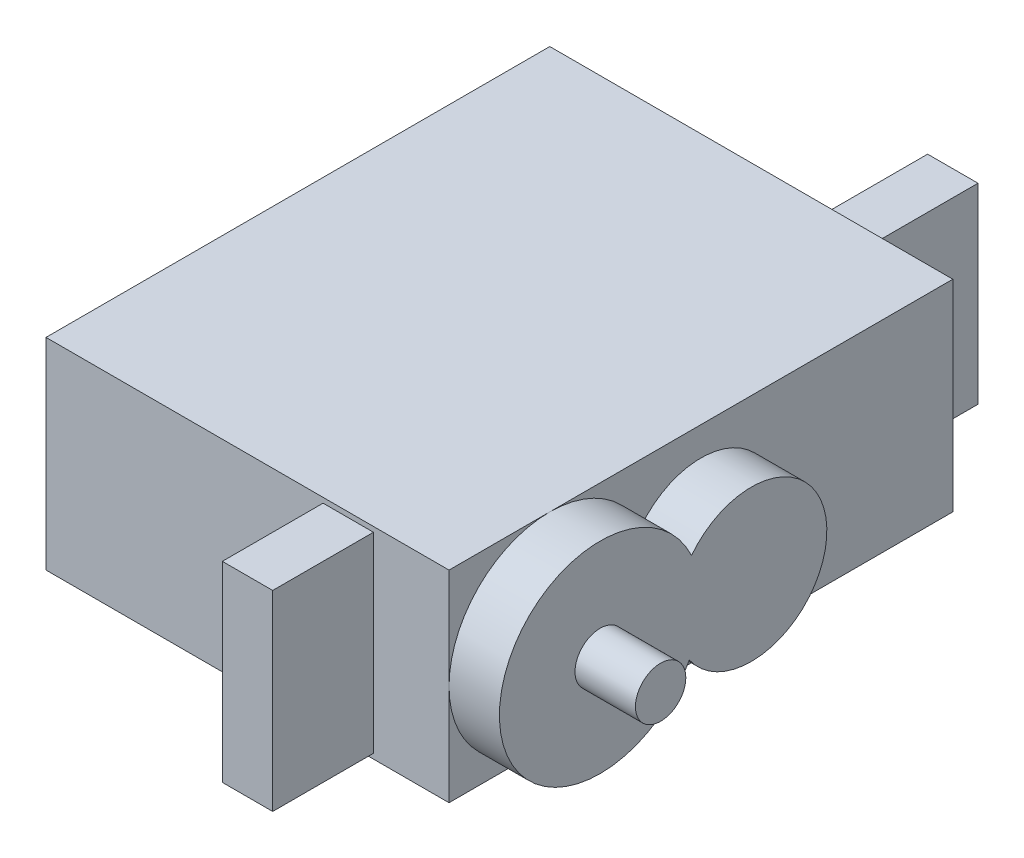
ISO-10303-21;
HEADER;
FILE_DESCRIPTION(('STEP AP214'),'2;1');
FILE_NAME('part.step','',(''),(''),'','','');
FILE_SCHEMA(('AUTOMOTIVE_DESIGN { 1 0 10303 214 1 1 1 1 }'));
ENDSEC;
DATA;
#1=APPLICATION_CONTEXT('core data for automotive mechanical design processes');
#2=APPLICATION_PROTOCOL_DEFINITION('international standard','automotive_design',2000,#1);
#3=PRODUCT_CONTEXT('',#1,'mechanical');
#4=PRODUCT('Part','Part','',(#3));
#5=PRODUCT_RELATED_PRODUCT_CATEGORY('part','',(#4));
#6=PRODUCT_DEFINITION_FORMATION('','',#4);
#7=PRODUCT_DEFINITION_CONTEXT('part definition',#1,'design');
#8=PRODUCT_DEFINITION('design','',#6,#7);
#9=PRODUCT_DEFINITION_SHAPE('','',#8);
#10=(LENGTH_UNIT() NAMED_UNIT(*) SI_UNIT(.MILLI.,.METRE.));
#11=(NAMED_UNIT(*) PLANE_ANGLE_UNIT() SI_UNIT($,.RADIAN.));
#12=(NAMED_UNIT(*) SI_UNIT($,.STERADIAN.) SOLID_ANGLE_UNIT());
#13=UNCERTAINTY_MEASURE_WITH_UNIT(LENGTH_MEASURE(1.E-05),#10,'distance_accuracy_value','');
#14=(GEOMETRIC_REPRESENTATION_CONTEXT(3) GLOBAL_UNCERTAINTY_ASSIGNED_CONTEXT((#13)) GLOBAL_UNIT_ASSIGNED_CONTEXT((#10,
#11,#12)) REPRESENTATION_CONTEXT('',''));
#15=CARTESIAN_POINT('',(0.,0.,0.));
#16=DIRECTION('',(0.,0.,1.));
#17=DIRECTION('',(1.,0.,0.));
#18=AXIS2_PLACEMENT_3D('',#15,#16,#17);
#19=CARTESIAN_POINT('',(10.,10.,12.5));
#20=DIRECTION('',(-1.,0.,0.));
#21=DIRECTION('',(0.,0.,1.));
#22=AXIS2_PLACEMENT_3D('',#19,#20,#21);
#23=PLANE('',#22);
#24=CARTESIAN_POINT('',(10.,4.81801900138163,0.));
#25=DIRECTION('',(1.,0.,0.));
#26=DIRECTION('',(0.,0.,-1.));
#27=AXIS2_PLACEMENT_3D('',#24,#25,#26);
#28=CIRCLE('',#27,3.75);
#29=CARTESIAN_POINT('',(10.,2.67182303274343,3.07511672367101));
#30=VERTEX_POINT('',#29);
#31=CARTESIAN_POINT('',(10.,7.11083159517213,2.96740802886218));
#32=VERTEX_POINT('',#31);
#33=EDGE_CURVE('E174',#30,#32,#28,.T.);
#34=ORIENTED_EDGE('',*,*,#33,.F.);
#35=CARTESIAN_POINT('',(10.,5.,7.5));
#36=DIRECTION('',(1.,0.,0.));
#37=DIRECTION('',(0.,0.,-1.));
#38=AXIS2_PLACEMENT_3D('',#35,#36,#37);
#39=CIRCLE('',#38,5.);
#40=CARTESIAN_POINT('',(10.,0.,7.5));
#41=VERTEX_POINT('',#40);
#42=EDGE_CURVE('E315',#41,#30,#39,.T.);
#43=ORIENTED_EDGE('',*,*,#42,.F.);
#44=DIRECTION('',(0.,0.,-1.));
#45=VECTOR('',#44,1.);
#46=CARTESIAN_POINT('',(10.,0.,12.5));
#47=LINE('',#46,#45);
#48=CARTESIAN_POINT('',(10.,0.,-12.5));
#49=VERTEX_POINT('',#48);
#50=EDGE_CURVE('E270',#41,#49,#47,.T.);
#51=ORIENTED_EDGE('',*,*,#50,.T.);
#52=DIRECTION('',(0.,-1.,0.));
#53=VECTOR('',#52,1.);
#54=CARTESIAN_POINT('',(10.,10.,-12.5));
#55=LINE('',#54,#53);
#56=CARTESIAN_POINT('',(10.,10.,-12.5));
#57=VERTEX_POINT('',#56);
#58=EDGE_CURVE('E46',#57,#49,#55,.T.);
#59=ORIENTED_EDGE('',*,*,#58,.F.);
#60=DIRECTION('',(0.,0.,-1.));
#61=VECTOR('',#60,1.);
#62=CARTESIAN_POINT('',(10.,10.,12.5));
#63=LINE('',#62,#61);
#64=CARTESIAN_POINT('',(10.,10.,7.5));
#65=VERTEX_POINT('',#64);
#66=EDGE_CURVE('E276',#65,#57,#63,.T.);
#67=ORIENTED_EDGE('',*,*,#66,.F.);
#68=EDGE_CURVE('E54',#32,#65,#39,.T.);
#69=ORIENTED_EDGE('',*,*,#68,.F.);
#70=EDGE_LOOP('',(#34,#43,#51,#59,#67,#69));
#71=FACE_BOUND('',#70,.T.);
#72=ADVANCED_FACE('F42',(#71),#23,.F.);
#73=CARTESIAN_POINT('',(10.,5.,12.5));
#74=VERTEX_POINT('',#73);
#75=EDGE_CURVE('E11',#65,#74,#39,.T.);
#76=ORIENTED_EDGE('',*,*,#75,.F.);
#77=CARTESIAN_POINT('',(10.,10.,12.5));
#78=VERTEX_POINT('',#77);
#79=EDGE_CURVE('E271',#78,#65,#63,.T.);
#80=ORIENTED_EDGE('',*,*,#79,.F.);
#81=DIRECTION('',(0.,-1.,0.));
#82=VECTOR('',#81,1.);
#83=CARTESIAN_POINT('',(10.,10.,12.5));
#84=LINE('',#83,#82);
#85=EDGE_CURVE('E299',#78,#74,#84,.T.);
#86=ORIENTED_EDGE('',*,*,#85,.T.);
#87=EDGE_LOOP('',(#76,#80,#86));
#88=FACE_BOUND('',#87,.T.);
#89=ADVANCED_FACE('F347',(#88),#23,.F.);
#90=CARTESIAN_POINT('',(-10.,10.,12.5));
#91=DIRECTION('',(0.,0.,-1.));
#92=DIRECTION('',(-1.,0.,0.));
#93=AXIS2_PLACEMENT_3D('',#90,#91,#92);
#94=PLANE('',#93);
#95=DIRECTION('',(1.,0.,0.));
#96=VECTOR('',#95,1.);
#97=CARTESIAN_POINT('',(-10.,0.,12.5));
#98=LINE('',#97,#96);
#99=CARTESIAN_POINT('',(-10.,0.,12.5));
#100=VERTEX_POINT('',#99);
#101=CARTESIAN_POINT('',(10.,0.,12.5));
#102=VERTEX_POINT('',#101);
#103=EDGE_CURVE('E295',#100,#102,#98,.T.);
#104=ORIENTED_EDGE('',*,*,#103,.T.);
#105=EDGE_CURVE('E285',#74,#102,#84,.T.);
#106=ORIENTED_EDGE('',*,*,#105,.F.);
#107=ORIENTED_EDGE('',*,*,#85,.F.);
#108=DIRECTION('',(1.,0.,0.));
#109=VECTOR('',#108,1.);
#110=CARTESIAN_POINT('',(-10.,10.,12.5));
#111=LINE('',#110,#109);
#112=CARTESIAN_POINT('',(-10.,10.,12.5));
#113=VERTEX_POINT('',#112);
#114=EDGE_CURVE('E282',#113,#78,#111,.T.);
#115=ORIENTED_EDGE('',*,*,#114,.F.);
#116=DIRECTION('',(0.,-1.,0.));
#117=VECTOR('',#116,1.);
#118=CARTESIAN_POINT('',(-10.,10.,12.5));
#119=LINE('',#118,#117);
#120=EDGE_CURVE('E303',#113,#100,#119,.T.);
#121=ORIENTED_EDGE('',*,*,#120,.T.);
#122=EDGE_LOOP('',(#104,#106,#107,#115,#121));
#123=FACE_BOUND('',#122,.T.);
#124=DIRECTION('',(0.,1.,0.));
#125=VECTOR('',#124,1.);
#126=CARTESIAN_POINT('',(6.25,0.250000000000003,12.5));
#127=LINE('',#126,#125);
#128=CARTESIAN_POINT('',(6.25,0.250000000000003,12.5));
#129=VERTEX_POINT('',#128);
#130=CARTESIAN_POINT('',(6.25,9.75,12.5));
#131=VERTEX_POINT('',#130);
#132=EDGE_CURVE('E176',#129,#131,#127,.T.);
#133=ORIENTED_EDGE('',*,*,#132,.F.);
#134=DIRECTION('',(1.,0.,0.));
#135=VECTOR('',#134,1.);
#136=CARTESIAN_POINT('',(3.75,0.250000000000003,12.5));
#137=LINE('',#136,#135);
#138=CARTESIAN_POINT('',(3.75,0.250000000000002,12.5));
#139=VERTEX_POINT('',#138);
#140=EDGE_CURVE('E190',#139,#129,#137,.T.);
#141=ORIENTED_EDGE('',*,*,#140,.F.);
#142=DIRECTION('',(0.,-1.,0.));
#143=VECTOR('',#142,1.);
#144=CARTESIAN_POINT('',(3.75,0.250000000000003,12.5));
#145=LINE('',#144,#143);
#146=CARTESIAN_POINT('',(3.75,9.75,12.5));
#147=VERTEX_POINT('',#146);
#148=EDGE_CURVE('E203',#147,#139,#145,.T.);
#149=ORIENTED_EDGE('',*,*,#148,.F.);
#150=DIRECTION('',(-1.,0.,0.));
#151=VECTOR('',#150,1.);
#152=CARTESIAN_POINT('',(3.75,9.75,12.5));
#153=LINE('',#152,#151);
#154=EDGE_CURVE('E181',#131,#147,#153,.T.);
#155=ORIENTED_EDGE('',*,*,#154,.F.);
#156=EDGE_LOOP('',(#133,#141,#149,#155));
#157=FACE_BOUND('',#156,.T.);
#158=ADVANCED_FACE('F351',(#123,#157),#94,.F.);
#159=CARTESIAN_POINT('',(-10.,10.,-12.5));
#160=DIRECTION('',(0.,0.,1.));
#161=DIRECTION('',(1.,0.,0.));
#162=AXIS2_PLACEMENT_3D('',#159,#160,#161);
#163=PLANE('',#162);
#164=DIRECTION('',(-1.,0.,0.));
#165=VECTOR('',#164,1.);
#166=CARTESIAN_POINT('',(-10.,0.,-12.5));
#167=LINE('',#166,#165);
#168=CARTESIAN_POINT('',(-10.,0.,-12.5));
#169=VERTEX_POINT('',#168);
#170=EDGE_CURVE('E289',#49,#169,#167,.T.);
#171=ORIENTED_EDGE('',*,*,#170,.T.);
#172=DIRECTION('',(0.,-1.,0.));
#173=VECTOR('',#172,1.);
#174=CARTESIAN_POINT('',(-10.,10.,-12.5));
#175=LINE('',#174,#173);
#176=CARTESIAN_POINT('',(-10.,10.,-12.5));
#177=VERTEX_POINT('',#176);
#178=EDGE_CURVE('E306',#177,#169,#175,.T.);
#179=ORIENTED_EDGE('',*,*,#178,.F.);
#180=DIRECTION('',(-1.,0.,0.));
#181=VECTOR('',#180,1.);
#182=CARTESIAN_POINT('',(-10.,10.,-12.5));
#183=LINE('',#182,#181);
#184=EDGE_CURVE('E275',#57,#177,#183,.T.);
#185=ORIENTED_EDGE('',*,*,#184,.F.);
#186=ORIENTED_EDGE('',*,*,#58,.T.);
#187=EDGE_LOOP('',(#171,#179,#185,#186));
#188=FACE_BOUND('',#187,.T.);
#189=DIRECTION('',(0.,1.,0.));
#190=VECTOR('',#189,1.);
#191=CARTESIAN_POINT('',(3.75,0.249999999999998,-12.5));
#192=LINE('',#191,#190);
#193=CARTESIAN_POINT('',(3.75,0.249999999999998,-12.5));
#194=VERTEX_POINT('',#193);
#195=CARTESIAN_POINT('',(3.75,9.75,-12.5));
#196=VERTEX_POINT('',#195);
#197=EDGE_CURVE('E225',#194,#196,#192,.T.);
#198=ORIENTED_EDGE('',*,*,#197,.F.);
#199=DIRECTION('',(-1.,0.,0.));
#200=VECTOR('',#199,1.);
#201=CARTESIAN_POINT('',(6.25,0.249999999999998,-12.5));
#202=LINE('',#201,#200);
#203=CARTESIAN_POINT('',(6.25,0.249999999999999,-12.5));
#204=VERTEX_POINT('',#203);
#205=EDGE_CURVE('E231',#204,#194,#202,.T.);
#206=ORIENTED_EDGE('',*,*,#205,.F.);
#207=DIRECTION('',(0.,-1.,0.));
#208=VECTOR('',#207,1.);
#209=CARTESIAN_POINT('',(6.25,0.249999999999998,-12.5));
#210=LINE('',#209,#208);
#211=CARTESIAN_POINT('',(6.25,9.75,-12.5));
#212=VERTEX_POINT('',#211);
#213=EDGE_CURVE('E248',#212,#204,#210,.T.);
#214=ORIENTED_EDGE('',*,*,#213,.F.);
#215=DIRECTION('',(1.,0.,0.));
#216=VECTOR('',#215,1.);
#217=CARTESIAN_POINT('',(6.25,9.75,-12.5));
#218=LINE('',#217,#216);
#219=EDGE_CURVE('E244',#196,#212,#218,.T.);
#220=ORIENTED_EDGE('',*,*,#219,.F.);
#221=EDGE_LOOP('',(#198,#206,#214,#220));
#222=FACE_BOUND('',#221,.T.);
#223=ADVANCED_FACE('F355',(#188,#222),#163,.F.);
#224=EDGE_CURVE('E52',#74,#41,#39,.T.);
#225=ORIENTED_EDGE('',*,*,#224,.F.);
#226=ORIENTED_EDGE('',*,*,#105,.T.);
#227=EDGE_CURVE('E286',#102,#41,#47,.T.);
#228=ORIENTED_EDGE('',*,*,#227,.T.);
#229=EDGE_LOOP('',(#225,#226,#228));
#230=FACE_BOUND('',#229,.T.);
#231=ADVANCED_FACE('F44',(#230),#23,.F.);
#232=CARTESIAN_POINT('',(-10.,10.,12.5));
#233=DIRECTION('',(1.,0.,0.));
#234=DIRECTION('',(0.,0.,-1.));
#235=AXIS2_PLACEMENT_3D('',#232,#233,#234);
#236=PLANE('',#235);
#237=DIRECTION('',(0.,0.,1.));
#238=VECTOR('',#237,1.);
#239=CARTESIAN_POINT('',(-10.,0.,12.5));
#240=LINE('',#239,#238);
#241=EDGE_CURVE('E292',#169,#100,#240,.T.);
#242=ORIENTED_EDGE('',*,*,#241,.T.);
#243=ORIENTED_EDGE('',*,*,#120,.F.);
#244=DIRECTION('',(0.,0.,1.));
#245=VECTOR('',#244,1.);
#246=CARTESIAN_POINT('',(-10.,10.,12.5));
#247=LINE('',#246,#245);
#248=EDGE_CURVE('E279',#177,#113,#247,.T.);
#249=ORIENTED_EDGE('',*,*,#248,.F.);
#250=ORIENTED_EDGE('',*,*,#178,.T.);
#251=EDGE_LOOP('',(#242,#243,#249,#250));
#252=FACE_BOUND('',#251,.T.);
#253=ADVANCED_FACE('F354',(#252),#236,.F.);
#254=CARTESIAN_POINT('',(0.,10.,0.));
#255=DIRECTION('',(0.,-1.,0.));
#256=DIRECTION('',(0.,0.,-1.));
#257=AXIS2_PLACEMENT_3D('',#254,#255,#256);
#258=PLANE('',#257);
#259=ORIENTED_EDGE('',*,*,#79,.T.);
#260=ORIENTED_EDGE('',*,*,#66,.T.);
#261=ORIENTED_EDGE('',*,*,#184,.T.);
#262=ORIENTED_EDGE('',*,*,#248,.T.);
#263=ORIENTED_EDGE('',*,*,#114,.T.);
#264=EDGE_LOOP('',(#259,#260,#261,#262,#263));
#265=FACE_BOUND('',#264,.T.);
#266=ADVANCED_FACE('F360',(#265),#258,.F.);
#267=CARTESIAN_POINT('',(0.,0.,0.));
#268=DIRECTION('',(0.,-1.,0.));
#269=DIRECTION('',(0.,0.,-1.));
#270=AXIS2_PLACEMENT_3D('',#267,#268,#269);
#271=PLANE('',#270);
#272=ORIENTED_EDGE('',*,*,#227,.F.);
#273=ORIENTED_EDGE('',*,*,#103,.F.);
#274=ORIENTED_EDGE('',*,*,#241,.F.);
#275=ORIENTED_EDGE('',*,*,#170,.F.);
#276=ORIENTED_EDGE('',*,*,#50,.F.);
#277=EDGE_LOOP('',(#272,#273,#274,#275,#276));
#278=FACE_BOUND('',#277,.T.);
#279=ADVANCED_FACE('F369',(#278),#271,.T.);
#280=CARTESIAN_POINT('',(3.75,0.249999999999998,-17.5));
#281=DIRECTION('',(1.,0.,0.));
#282=DIRECTION('',(0.,0.,-1.));
#283=AXIS2_PLACEMENT_3D('',#280,#281,#282);
#284=PLANE('',#283);
#285=ORIENTED_EDGE('',*,*,#197,.T.);
#286=DIRECTION('',(0.,0.,1.));
#287=VECTOR('',#286,1.);
#288=CARTESIAN_POINT('',(3.75,9.75,-17.5));
#289=LINE('',#288,#287);
#290=CARTESIAN_POINT('',(3.75,9.75,-17.5));
#291=VERTEX_POINT('',#290);
#292=EDGE_CURVE('E266',#291,#196,#289,.T.);
#293=ORIENTED_EDGE('',*,*,#292,.F.);
#294=DIRECTION('',(0.,1.,0.));
#295=VECTOR('',#294,1.);
#296=CARTESIAN_POINT('',(3.75,0.249999999999998,-17.5));
#297=LINE('',#296,#295);
#298=CARTESIAN_POINT('',(3.75,0.249999999999998,-17.5));
#299=VERTEX_POINT('',#298);
#300=EDGE_CURVE('E226',#299,#291,#297,.T.);
#301=ORIENTED_EDGE('',*,*,#300,.F.);
#302=DIRECTION('',(0.,0.,1.));
#303=VECTOR('',#302,1.);
#304=CARTESIAN_POINT('',(3.75,0.249999999999998,-17.5));
#305=LINE('',#304,#303);
#306=EDGE_CURVE('E240',#299,#194,#305,.T.);
#307=ORIENTED_EDGE('',*,*,#306,.T.);
#308=EDGE_LOOP('',(#285,#293,#301,#307));
#309=FACE_BOUND('',#308,.T.);
#310=ADVANCED_FACE('F372',(#309),#284,.F.);
#311=CARTESIAN_POINT('',(6.25,9.75,-17.5));
#312=DIRECTION('',(0.,-1.,0.));
#313=DIRECTION('',(0.,0.,-1.));
#314=AXIS2_PLACEMENT_3D('',#311,#312,#313);
#315=PLANE('',#314);
#316=ORIENTED_EDGE('',*,*,#219,.T.);
#317=DIRECTION('',(0.,0.,1.));
#318=VECTOR('',#317,1.);
#319=CARTESIAN_POINT('',(6.25,9.75,-17.5));
#320=LINE('',#319,#318);
#321=CARTESIAN_POINT('',(6.25,9.75,-17.5));
#322=VERTEX_POINT('',#321);
#323=EDGE_CURVE('E262',#322,#212,#320,.T.);
#324=ORIENTED_EDGE('',*,*,#323,.F.);
#325=DIRECTION('',(1.,0.,0.));
#326=VECTOR('',#325,1.);
#327=CARTESIAN_POINT('',(6.25,9.75,-17.5));
#328=LINE('',#327,#326);
#329=EDGE_CURVE('E230',#291,#322,#328,.T.);
#330=ORIENTED_EDGE('',*,*,#329,.F.);
#331=ORIENTED_EDGE('',*,*,#292,.T.);
#332=EDGE_LOOP('',(#316,#324,#330,#331));
#333=FACE_BOUND('',#332,.T.);
#334=ADVANCED_FACE('F379',(#333),#315,.F.);
#335=CARTESIAN_POINT('',(6.25,0.249999999999998,-17.5));
#336=DIRECTION('',(-1.,0.,0.));
#337=DIRECTION('',(0.,0.,1.));
#338=AXIS2_PLACEMENT_3D('',#335,#336,#337);
#339=PLANE('',#338);
#340=ORIENTED_EDGE('',*,*,#213,.T.);
#341=DIRECTION('',(0.,0.,1.));
#342=VECTOR('',#341,1.);
#343=CARTESIAN_POINT('',(6.25,0.249999999999998,-17.5));
#344=LINE('',#343,#342);
#345=CARTESIAN_POINT('',(6.25,0.249999999999998,-17.5));
#346=VERTEX_POINT('',#345);
#347=EDGE_CURVE('E258',#346,#204,#344,.T.);
#348=ORIENTED_EDGE('',*,*,#347,.F.);
#349=DIRECTION('',(0.,-1.,0.));
#350=VECTOR('',#349,1.);
#351=CARTESIAN_POINT('',(6.25,0.249999999999998,-17.5));
#352=LINE('',#351,#350);
#353=EDGE_CURVE('E234',#322,#346,#352,.T.);
#354=ORIENTED_EDGE('',*,*,#353,.F.);
#355=ORIENTED_EDGE('',*,*,#323,.T.);
#356=EDGE_LOOP('',(#340,#348,#354,#355));
#357=FACE_BOUND('',#356,.T.);
#358=ADVANCED_FACE('F383',(#357),#339,.F.);
#359=CARTESIAN_POINT('',(6.25,0.249999999999998,-17.5));
#360=DIRECTION('',(0.,1.,0.));
#361=DIRECTION('',(0.,0.,1.));
#362=AXIS2_PLACEMENT_3D('',#359,#360,#361);
#363=PLANE('',#362);
#364=ORIENTED_EDGE('',*,*,#205,.T.);
#365=ORIENTED_EDGE('',*,*,#306,.F.);
#366=DIRECTION('',(-1.,0.,0.));
#367=VECTOR('',#366,1.);
#368=CARTESIAN_POINT('',(6.25,0.249999999999998,-17.5));
#369=LINE('',#368,#367);
#370=EDGE_CURVE('E237',#346,#299,#369,.T.);
#371=ORIENTED_EDGE('',*,*,#370,.F.);
#372=ORIENTED_EDGE('',*,*,#347,.T.);
#373=EDGE_LOOP('',(#364,#365,#371,#372));
#374=FACE_BOUND('',#373,.T.);
#375=ADVANCED_FACE('F387',(#374),#363,.F.);
#376=CARTESIAN_POINT('',(0.,0.,-17.5));
#377=DIRECTION('',(0.,0.,1.));
#378=DIRECTION('',(1.,0.,0.));
#379=AXIS2_PLACEMENT_3D('',#376,#377,#378);
#380=PLANE('',#379);
#381=ORIENTED_EDGE('',*,*,#300,.T.);
#382=ORIENTED_EDGE('',*,*,#329,.T.);
#383=ORIENTED_EDGE('',*,*,#353,.T.);
#384=ORIENTED_EDGE('',*,*,#370,.T.);
#385=EDGE_LOOP('',(#381,#382,#383,#384));
#386=FACE_BOUND('',#385,.T.);
#387=ADVANCED_FACE('F391',(#386),#380,.F.);
#388=CARTESIAN_POINT('',(6.25,0.250000000000003,17.5));
#389=DIRECTION('',(-1.,0.,0.));
#390=DIRECTION('',(0.,0.,1.));
#391=AXIS2_PLACEMENT_3D('',#388,#389,#390);
#392=PLANE('',#391);
#393=ORIENTED_EDGE('',*,*,#132,.T.);
#394=DIRECTION('',(0.,0.,-1.));
#395=VECTOR('',#394,1.);
#396=CARTESIAN_POINT('',(6.25,9.75,17.5));
#397=LINE('',#396,#395);
#398=CARTESIAN_POINT('',(6.25,9.75,17.5));
#399=VERTEX_POINT('',#398);
#400=EDGE_CURVE('E221',#399,#131,#397,.T.);
#401=ORIENTED_EDGE('',*,*,#400,.F.);
#402=DIRECTION('',(0.,1.,0.));
#403=VECTOR('',#402,1.);
#404=CARTESIAN_POINT('',(6.25,0.250000000000003,17.5));
#405=LINE('',#404,#403);
#406=CARTESIAN_POINT('',(6.25,0.250000000000003,17.5));
#407=VERTEX_POINT('',#406);
#408=EDGE_CURVE('E185',#407,#399,#405,.T.);
#409=ORIENTED_EDGE('',*,*,#408,.F.);
#410=DIRECTION('',(0.,0.,-1.));
#411=VECTOR('',#410,1.);
#412=CARTESIAN_POINT('',(6.25,0.250000000000003,17.5));
#413=LINE('',#412,#411);
#414=EDGE_CURVE('E198',#407,#129,#413,.T.);
#415=ORIENTED_EDGE('',*,*,#414,.T.);
#416=EDGE_LOOP('',(#393,#401,#409,#415));
#417=FACE_BOUND('',#416,.T.);
#418=ADVANCED_FACE('F395',(#417),#392,.F.);
#419=CARTESIAN_POINT('',(3.75,9.75,17.5));
#420=DIRECTION('',(0.,-1.,0.));
#421=DIRECTION('',(0.,0.,-1.));
#422=AXIS2_PLACEMENT_3D('',#419,#420,#421);
#423=PLANE('',#422);
#424=ORIENTED_EDGE('',*,*,#154,.T.);
#425=DIRECTION('',(0.,0.,-1.));
#426=VECTOR('',#425,1.);
#427=CARTESIAN_POINT('',(3.75,9.75,17.5));
#428=LINE('',#427,#426);
#429=CARTESIAN_POINT('',(3.75,9.75,17.5));
#430=VERTEX_POINT('',#429);
#431=EDGE_CURVE('E217',#430,#147,#428,.T.);
#432=ORIENTED_EDGE('',*,*,#431,.F.);
#433=DIRECTION('',(-1.,0.,0.));
#434=VECTOR('',#433,1.);
#435=CARTESIAN_POINT('',(3.75,9.75,17.5));
#436=LINE('',#435,#434);
#437=EDGE_CURVE('E189',#399,#430,#436,.T.);
#438=ORIENTED_EDGE('',*,*,#437,.F.);
#439=ORIENTED_EDGE('',*,*,#400,.T.);
#440=EDGE_LOOP('',(#424,#432,#438,#439));
#441=FACE_BOUND('',#440,.T.);
#442=ADVANCED_FACE('F399',(#441),#423,.F.);
#443=CARTESIAN_POINT('',(3.75,0.250000000000003,17.5));
#444=DIRECTION('',(1.,0.,0.));
#445=DIRECTION('',(0.,0.,-1.));
#446=AXIS2_PLACEMENT_3D('',#443,#444,#445);
#447=PLANE('',#446);
#448=ORIENTED_EDGE('',*,*,#148,.T.);
#449=DIRECTION('',(0.,0.,-1.));
#450=VECTOR('',#449,1.);
#451=CARTESIAN_POINT('',(3.75,0.250000000000003,17.5));
#452=LINE('',#451,#450);
#453=CARTESIAN_POINT('',(3.75,0.250000000000003,17.5));
#454=VERTEX_POINT('',#453);
#455=EDGE_CURVE('E213',#454,#139,#452,.T.);
#456=ORIENTED_EDGE('',*,*,#455,.F.);
#457=DIRECTION('',(0.,-1.,0.));
#458=VECTOR('',#457,1.);
#459=CARTESIAN_POINT('',(3.75,0.250000000000003,17.5));
#460=LINE('',#459,#458);
#461=EDGE_CURVE('E193',#430,#454,#460,.T.);
#462=ORIENTED_EDGE('',*,*,#461,.F.);
#463=ORIENTED_EDGE('',*,*,#431,.T.);
#464=EDGE_LOOP('',(#448,#456,#462,#463));
#465=FACE_BOUND('',#464,.T.);
#466=ADVANCED_FACE('F403',(#465),#447,.F.);
#467=CARTESIAN_POINT('',(3.75,0.250000000000003,17.5));
#468=DIRECTION('',(0.,1.,0.));
#469=DIRECTION('',(0.,0.,1.));
#470=AXIS2_PLACEMENT_3D('',#467,#468,#469);
#471=PLANE('',#470);
#472=ORIENTED_EDGE('',*,*,#140,.T.);
#473=ORIENTED_EDGE('',*,*,#414,.F.);
#474=DIRECTION('',(1.,0.,0.));
#475=VECTOR('',#474,1.);
#476=CARTESIAN_POINT('',(3.75,0.250000000000003,17.5));
#477=LINE('',#476,#475);
#478=EDGE_CURVE('E196',#454,#407,#477,.T.);
#479=ORIENTED_EDGE('',*,*,#478,.F.);
#480=ORIENTED_EDGE('',*,*,#455,.T.);
#481=EDGE_LOOP('',(#472,#473,#479,#480));
#482=FACE_BOUND('',#481,.T.);
#483=ADVANCED_FACE('F407',(#482),#471,.F.);
#484=CARTESIAN_POINT('',(0.,0.,17.5));
#485=DIRECTION('',(0.,0.,-1.));
#486=DIRECTION('',(-1.,0.,0.));
#487=AXIS2_PLACEMENT_3D('',#484,#485,#486);
#488=PLANE('',#487);
#489=ORIENTED_EDGE('',*,*,#408,.T.);
#490=ORIENTED_EDGE('',*,*,#437,.T.);
#491=ORIENTED_EDGE('',*,*,#461,.T.);
#492=ORIENTED_EDGE('',*,*,#478,.T.);
#493=EDGE_LOOP('',(#489,#490,#491,#492));
#494=FACE_BOUND('',#493,.T.);
#495=ADVANCED_FACE('F411',(#494),#488,.F.);
#496=CARTESIAN_POINT('',(12.5,4.81801900138163,0.));
#497=DIRECTION('',(-1.,0.,0.));
#498=DIRECTION('',(0.,0.,1.));
#499=AXIS2_PLACEMENT_3D('',#496,#497,#498);
#500=CYLINDRICAL_SURFACE('',#499,3.75);
#501=ORIENTED_EDGE('',*,*,#33,.T.);
#502=DIRECTION('',(-1.,0.,0.));
#503=VECTOR('',#502,1.);
#504=CARTESIAN_POINT('',(12.5,7.11083159517213,2.96740802886218));
#505=LINE('',#504,#503);
#506=CARTESIAN_POINT('',(12.5,7.11083159517213,2.96740802886218));
#507=VERTEX_POINT('',#506);
#508=EDGE_CURVE('E159',#507,#32,#505,.T.);
#509=ORIENTED_EDGE('',*,*,#508,.F.);
#510=CARTESIAN_POINT('',(12.5,4.81801900138163,0.));
#511=DIRECTION('',(1.,0.,0.));
#512=DIRECTION('',(0.,0.,-1.));
#513=AXIS2_PLACEMENT_3D('',#510,#511,#512);
#514=CIRCLE('',#513,3.75);
#515=CARTESIAN_POINT('',(12.5,2.67182303274343,3.07511672367101));
#516=VERTEX_POINT('',#515);
#517=EDGE_CURVE('E167',#516,#507,#514,.T.);
#518=ORIENTED_EDGE('',*,*,#517,.F.);
#519=DIRECTION('',(-1.,0.,0.));
#520=VECTOR('',#519,1.);
#521=CARTESIAN_POINT('',(12.5,2.67182303274343,3.07511672367101));
#522=LINE('',#521,#520);
#523=EDGE_CURVE('E163',#516,#30,#522,.T.);
#524=ORIENTED_EDGE('',*,*,#523,.T.);
#525=EDGE_LOOP('',(#501,#509,#518,#524));
#526=FACE_BOUND('',#525,.T.);
#527=ADVANCED_FACE('F173',(#526),#500,.T.);
#528=CARTESIAN_POINT('',(12.5,5.,7.5));
#529=DIRECTION('',(-1.,0.,0.));
#530=DIRECTION('',(0.,0.,1.));
#531=AXIS2_PLACEMENT_3D('',#528,#529,#530);
#532=CYLINDRICAL_SURFACE('',#531,5.);
#533=ORIENTED_EDGE('',*,*,#68,.T.);
#534=ORIENTED_EDGE('',*,*,#75,.T.);
#535=ORIENTED_EDGE('',*,*,#224,.T.);
#536=ORIENTED_EDGE('',*,*,#42,.T.);
#537=ORIENTED_EDGE('',*,*,#523,.F.);
#538=CARTESIAN_POINT('',(12.5,5.,7.5));
#539=DIRECTION('',(1.,0.,0.));
#540=DIRECTION('',(0.,0.,-1.));
#541=AXIS2_PLACEMENT_3D('',#538,#539,#540);
#542=CIRCLE('',#541,5.);
#543=EDGE_CURVE('E155',#507,#516,#542,.T.);
#544=ORIENTED_EDGE('',*,*,#543,.F.);
#545=ORIENTED_EDGE('',*,*,#508,.T.);
#546=EDGE_LOOP('',(#533,#534,#535,#536,#537,#544,#545));
#547=FACE_BOUND('',#546,.T.);
#548=ADVANCED_FACE('F157',(#547),#532,.T.);
#549=CARTESIAN_POINT('',(12.5,4.90900950069082,3.75));
#550=DIRECTION('',(1.,0.,0.));
#551=DIRECTION('',(0.,0.,-1.));
#552=AXIS2_PLACEMENT_3D('',#549,#550,#551);
#553=PLANE('',#552);
#554=CARTESIAN_POINT('',(12.5,5.,7.5));
#555=DIRECTION('',(1.,0.,0.));
#556=DIRECTION('',(0.,0.,-1.));
#557=AXIS2_PLACEMENT_3D('',#554,#555,#556);
#558=CIRCLE('',#557,1.25);
#559=CARTESIAN_POINT('',(12.5,5.,6.25));
#560=VERTEX_POINT('',#559);
#561=EDGE_CURVE('E327',#560,#560,#558,.T.);
#562=ORIENTED_EDGE('',*,*,#561,.F.);
#563=EDGE_LOOP('',(#562));
#564=FACE_BOUND('',#563,.T.);
#565=ORIENTED_EDGE('',*,*,#517,.T.);
#566=ORIENTED_EDGE('',*,*,#543,.T.);
#567=EDGE_LOOP('',(#565,#566));
#568=FACE_BOUND('',#567,.T.);
#569=ADVANCED_FACE('F169',(#564,#568),#553,.T.);
#570=CARTESIAN_POINT('',(15.5,5.,7.5));
#571=DIRECTION('',(-1.,0.,0.));
#572=DIRECTION('',(0.,0.,1.));
#573=AXIS2_PLACEMENT_3D('',#570,#571,#572);
#574=CYLINDRICAL_SURFACE('',#573,1.25);
#575=CARTESIAN_POINT('',(15.5,5.,7.5));
#576=DIRECTION('',(1.,0.,0.));
#577=DIRECTION('',(0.,0.,-1.));
#578=AXIS2_PLACEMENT_3D('',#575,#576,#577);
#579=CIRCLE('',#578,1.25);
#580=CARTESIAN_POINT('',(15.5,5.,6.25));
#581=VERTEX_POINT('',#580);
#582=EDGE_CURVE('E324',#581,#581,#579,.T.);
#583=ORIENTED_EDGE('',*,*,#582,.F.);
#584=EDGE_LOOP('',(#583));
#585=FACE_BOUND('',#584,.T.);
#586=ORIENTED_EDGE('',*,*,#561,.T.);
#587=EDGE_LOOP('',(#586));
#588=FACE_BOUND('',#587,.T.);
#589=ADVANCED_FACE('F334',(#585,#588),#574,.T.);
#590=CARTESIAN_POINT('',(15.5,5.,7.5));
#591=DIRECTION('',(1.,0.,0.));
#592=DIRECTION('',(0.,0.,-1.));
#593=AXIS2_PLACEMENT_3D('',#590,#591,#592);
#594=PLANE('',#593);
#595=ORIENTED_EDGE('',*,*,#582,.T.);
#596=EDGE_LOOP('',(#595));
#597=FACE_BOUND('',#596,.T.);
#598=ADVANCED_FACE('F342',(#597),#594,.T.);
#599=CLOSED_SHELL('',(#72,#89,#158,#223,#231,#253,#266,#279,#310,#334,#358,#375,#387,#418,#442,
#466,#483,#495,#527,#548,#569,#589,#598));
#600=MANIFOLD_SOLID_BREP('B2',#599);
#601=ADVANCED_BREP_SHAPE_REPRESENTATION('',(#18,#600),#14);
#602=SHAPE_DEFINITION_REPRESENTATION(#9,#601);
ENDSEC;
END-ISO-10303-21;
